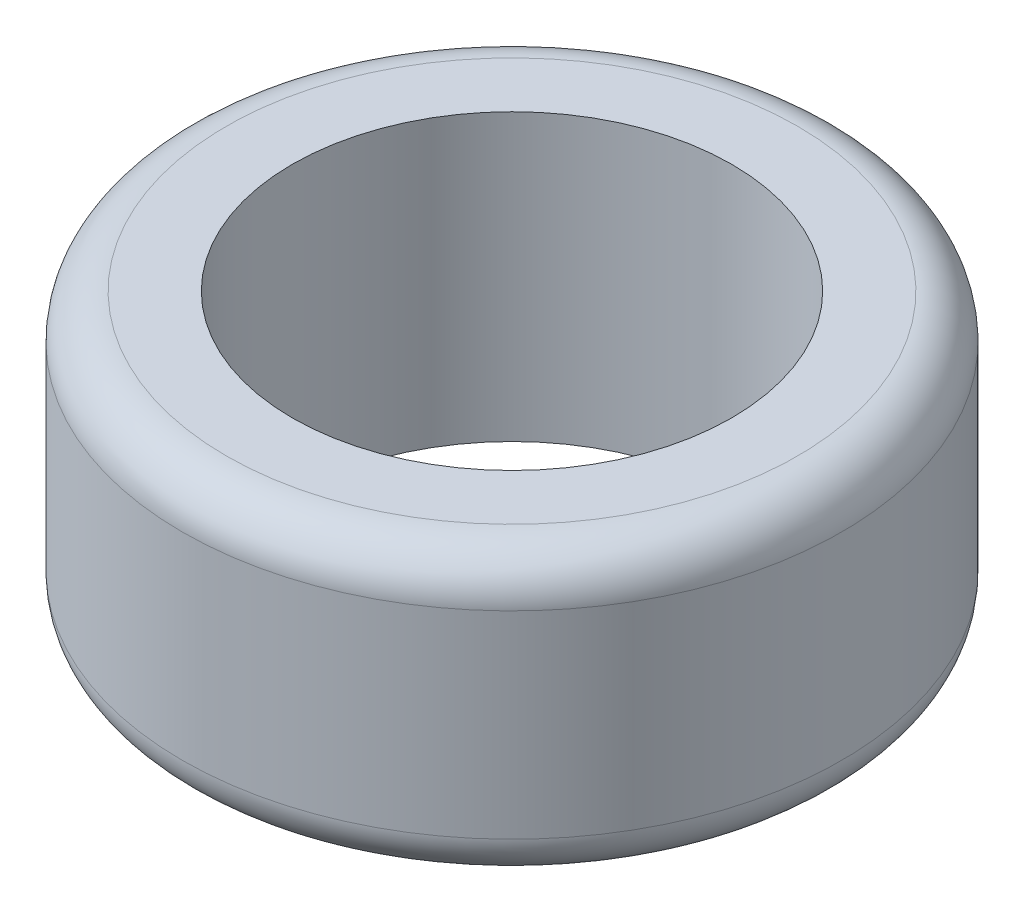
ISO-10303-21;
HEADER;
FILE_DESCRIPTION(('STEP AP214'),'2;1');
FILE_NAME('part.step','',(''),(''),'','','');
FILE_SCHEMA(('AUTOMOTIVE_DESIGN { 1 0 10303 214 1 1 1 1 }'));
ENDSEC;
DATA;
#1=APPLICATION_CONTEXT('core data for automotive mechanical design processes');
#2=APPLICATION_PROTOCOL_DEFINITION('international standard','automotive_design',2000,#1);
#3=PRODUCT_CONTEXT('',#1,'mechanical');
#4=PRODUCT('Part','Part','',(#3));
#5=PRODUCT_RELATED_PRODUCT_CATEGORY('part','',(#4));
#6=PRODUCT_DEFINITION_FORMATION('','',#4);
#7=PRODUCT_DEFINITION_CONTEXT('part definition',#1,'design');
#8=PRODUCT_DEFINITION('design','',#6,#7);
#9=PRODUCT_DEFINITION_SHAPE('','',#8);
#10=(LENGTH_UNIT() NAMED_UNIT(*) SI_UNIT(.MILLI.,.METRE.));
#11=(NAMED_UNIT(*) PLANE_ANGLE_UNIT() SI_UNIT($,.RADIAN.));
#12=(NAMED_UNIT(*) SI_UNIT($,.STERADIAN.) SOLID_ANGLE_UNIT());
#13=UNCERTAINTY_MEASURE_WITH_UNIT(LENGTH_MEASURE(1.E-05),#10,'distance_accuracy_value','');
#14=(GEOMETRIC_REPRESENTATION_CONTEXT(3) GLOBAL_UNCERTAINTY_ASSIGNED_CONTEXT((#13)) GLOBAL_UNIT_ASSIGNED_CONTEXT((#10,
#11,#12)) REPRESENTATION_CONTEXT('',''));
#15=CARTESIAN_POINT('',(0.,0.,0.));
#16=DIRECTION('',(0.,0.,1.));
#17=DIRECTION('',(1.,0.,0.));
#18=AXIS2_PLACEMENT_3D('',#15,#16,#17);
#19=CARTESIAN_POINT('',(0.,13.,0.));
#20=DIRECTION('',(0.,1.,0.));
#21=DIRECTION('',(0.,0.,1.));
#22=AXIS2_PLACEMENT_3D('',#19,#20,#21);
#23=PLANE('',#22);
#24=CARTESIAN_POINT('',(0.,13.,0.));
#25=DIRECTION('',(0.,1.,0.));
#26=DIRECTION('',(0.,0.,1.));
#27=AXIS2_PLACEMENT_3D('',#24,#25,#26);
#28=CIRCLE('',#27,13.);
#29=CARTESIAN_POINT('',(0.,13.,13.));
#30=VERTEX_POINT('',#29);
#31=EDGE_CURVE('E10',#30,#30,#28,.T.);
#32=ORIENTED_EDGE('',*,*,#31,.T.);
#33=EDGE_LOOP('',(#32));
#34=FACE_BOUND('',#33,.T.);
#35=CARTESIAN_POINT('',(0.,13.,0.));
#36=DIRECTION('',(0.,1.,0.));
#37=DIRECTION('',(0.,0.,1.));
#38=AXIS2_PLACEMENT_3D('',#35,#36,#37);
#39=CIRCLE('',#38,10.);
#40=CARTESIAN_POINT('',(0.,13.,-10.));
#41=VERTEX_POINT('',#40);
#42=EDGE_CURVE('E54',#41,#41,#39,.T.);
#43=ORIENTED_EDGE('',*,*,#42,.F.);
#44=EDGE_LOOP('',(#43));
#45=FACE_BOUND('',#44,.T.);
#46=ADVANCED_FACE('F34',(#34,#45),#23,.T.);
#47=CARTESIAN_POINT('',(0.,0.,0.));
#48=DIRECTION('',(0.,1.,0.));
#49=DIRECTION('',(0.,0.,1.));
#50=AXIS2_PLACEMENT_3D('',#47,#48,#49);
#51=PLANE('',#50);
#52=CARTESIAN_POINT('',(0.,0.,0.));
#53=DIRECTION('',(0.,1.,0.));
#54=DIRECTION('',(0.,0.,1.));
#55=AXIS2_PLACEMENT_3D('',#52,#53,#54);
#56=CIRCLE('',#55,13.);
#57=CARTESIAN_POINT('',(0.,0.,13.));
#58=VERTEX_POINT('',#57);
#59=EDGE_CURVE('E41',#58,#58,#56,.F.);
#60=ORIENTED_EDGE('',*,*,#59,.T.);
#61=EDGE_LOOP('',(#60));
#62=FACE_BOUND('',#61,.T.);
#63=CARTESIAN_POINT('',(0.,0.,0.));
#64=DIRECTION('',(0.,1.,0.));
#65=DIRECTION('',(0.,0.,1.));
#66=AXIS2_PLACEMENT_3D('',#63,#64,#65);
#67=CIRCLE('',#66,10.);
#68=CARTESIAN_POINT('',(0.,0.,-10.));
#69=VERTEX_POINT('',#68);
#70=EDGE_CURVE('E55',#69,#69,#67,.T.);
#71=ORIENTED_EDGE('',*,*,#70,.T.);
#72=EDGE_LOOP('',(#71));
#73=FACE_BOUND('',#72,.T.);
#74=ADVANCED_FACE('F65',(#62,#73),#51,.F.);
#75=CARTESIAN_POINT('',(0.,13.,0.));
#76=DIRECTION('',(0.,-1.,0.));
#77=DIRECTION('',(0.,0.,-1.));
#78=AXIS2_PLACEMENT_3D('',#75,#76,#77);
#79=CYLINDRICAL_SURFACE('',#78,15.);
#80=CARTESIAN_POINT('',(0.,2.,0.));
#81=DIRECTION('',(0.,1.,0.));
#82=DIRECTION('',(0.,0.,1.));
#83=AXIS2_PLACEMENT_3D('',#80,#81,#82);
#84=CIRCLE('',#83,15.);
#85=CARTESIAN_POINT('',(0.,2.,-15.));
#86=VERTEX_POINT('',#85);
#87=EDGE_CURVE('E45',#86,#86,#84,.T.);
#88=CARTESIAN_POINT('',(0.,11.,0.));
#89=DIRECTION('',(0.,1.,0.));
#90=DIRECTION('',(0.,0.,1.));
#91=AXIS2_PLACEMENT_3D('',#88,#89,#90);
#92=CIRCLE('',#91,15.);
#93=CARTESIAN_POINT('',(0.,11.,-15.));
#94=VERTEX_POINT('',#93);
#95=EDGE_CURVE('E49',#94,#94,#92,.F.);
#96=CARTESIAN_POINT('',(0.,2.,-15.));
#97=CARTESIAN_POINT('',(0.,2.09375,-15.));
#98=CARTESIAN_POINT('',(0.,2.1875,-15.));
#99=CARTESIAN_POINT('',(0.,2.375,-15.));
#100=CARTESIAN_POINT('',(0.,2.46875,-15.));
#101=CARTESIAN_POINT('',(0.,2.65625,-15.));
#102=CARTESIAN_POINT('',(0.,2.75,-15.));
#103=CARTESIAN_POINT('',(0.,2.9375,-15.));
#104=CARTESIAN_POINT('',(0.,3.03125,-15.));
#105=CARTESIAN_POINT('',(0.,3.21875,-15.));
#106=CARTESIAN_POINT('',(0.,3.3125,-15.));
#107=CARTESIAN_POINT('',(0.,3.5,-15.));
#108=CARTESIAN_POINT('',(0.,3.59375,-15.));
#109=CARTESIAN_POINT('',(0.,3.78125,-15.));
#110=CARTESIAN_POINT('',(0.,3.875,-15.));
#111=CARTESIAN_POINT('',(0.,4.0625,-15.));
#112=CARTESIAN_POINT('',(0.,4.15625,-15.));
#113=CARTESIAN_POINT('',(0.,4.34375,-15.));
#114=CARTESIAN_POINT('',(0.,4.4375,-15.));
#115=CARTESIAN_POINT('',(0.,4.625,-15.));
#116=CARTESIAN_POINT('',(0.,4.71875,-15.));
#117=CARTESIAN_POINT('',(0.,4.90625,-15.));
#118=CARTESIAN_POINT('',(0.,5.,-15.));
#119=CARTESIAN_POINT('',(0.,5.1875,-15.));
#120=CARTESIAN_POINT('',(0.,5.28125,-15.));
#121=CARTESIAN_POINT('',(0.,5.46875,-15.));
#122=CARTESIAN_POINT('',(0.,5.5625,-15.));
#123=CARTESIAN_POINT('',(0.,5.75,-15.));
#124=CARTESIAN_POINT('',(0.,5.84375,-15.));
#125=CARTESIAN_POINT('',(0.,6.03125,-15.));
#126=CARTESIAN_POINT('',(0.,6.125,-15.));
#127=CARTESIAN_POINT('',(0.,6.3125,-15.));
#128=CARTESIAN_POINT('',(0.,6.40625,-15.));
#129=CARTESIAN_POINT('',(0.,6.59375,-15.));
#130=CARTESIAN_POINT('',(0.,6.6875,-15.));
#131=CARTESIAN_POINT('',(0.,6.875,-15.));
#132=CARTESIAN_POINT('',(0.,6.96875,-15.));
#133=CARTESIAN_POINT('',(0.,7.15625,-15.));
#134=CARTESIAN_POINT('',(0.,7.25,-15.));
#135=CARTESIAN_POINT('',(0.,7.4375,-15.));
#136=CARTESIAN_POINT('',(0.,7.53125,-15.));
#137=CARTESIAN_POINT('',(0.,7.71875,-15.));
#138=CARTESIAN_POINT('',(0.,7.8125,-15.));
#139=CARTESIAN_POINT('',(0.,8.,-15.));
#140=CARTESIAN_POINT('',(0.,8.09375,-15.));
#141=CARTESIAN_POINT('',(0.,8.28125,-15.));
#142=CARTESIAN_POINT('',(0.,8.375,-15.));
#143=CARTESIAN_POINT('',(0.,8.5625,-15.));
#144=CARTESIAN_POINT('',(0.,8.65625,-15.));
#145=CARTESIAN_POINT('',(0.,8.84375,-15.));
#146=CARTESIAN_POINT('',(0.,8.9375,-15.));
#147=CARTESIAN_POINT('',(0.,9.125,-15.));
#148=CARTESIAN_POINT('',(0.,9.21875,-15.));
#149=CARTESIAN_POINT('',(0.,9.40625,-15.));
#150=CARTESIAN_POINT('',(0.,9.5,-15.));
#151=CARTESIAN_POINT('',(0.,9.6875,-15.));
#152=CARTESIAN_POINT('',(0.,9.78125,-15.));
#153=CARTESIAN_POINT('',(0.,9.96875,-15.));
#154=CARTESIAN_POINT('',(0.,10.0625,-15.));
#155=CARTESIAN_POINT('',(0.,10.25,-15.));
#156=CARTESIAN_POINT('',(0.,10.34375,-15.));
#157=CARTESIAN_POINT('',(0.,10.53125,-15.));
#158=CARTESIAN_POINT('',(0.,10.625,-15.));
#159=CARTESIAN_POINT('',(0.,10.8125,-15.));
#160=CARTESIAN_POINT('',(0.,10.90625,-15.));
#161=CARTESIAN_POINT('',(0.,11.,-15.));
#162=B_SPLINE_CURVE_WITH_KNOTS('',3,(#96,#97,#98,#99,#100,#101,#102,#103,#104,#105,#106,#107,
#108,#109,#110,#111,#112,#113,#114,#115,#116,#117,#118,#119,#120,#121,#122,#123,#124,#125,#126,
#127,#128,#129,#130,#131,#132,#133,#134,#135,#136,#137,#138,#139,#140,#141,#142,#143,#144,#145,
#146,#147,#148,#149,#150,#151,#152,#153,#154,#155,#156,#157,#158,#159,#160,#161),.UNSPECIFIED.,
.F.,.F.,(4,2,2,2,2,2,2,2,2,2,2,2,2,2,2,2,2,2,2,2,2,2,2,2,2,2,2,2,2,2,2,2,4),(0.,0.28125,0.5625,
0.843750000000001,1.125,1.40625,1.6875,1.96875,2.25,2.53125,2.8125,3.09375,3.375,3.65625,3.9375,
4.21875,4.5,4.78125,5.0625,5.34375,5.625,5.90625,6.1875,6.46875,6.75,7.03125,7.3125,7.59375,
7.875,8.15625,8.4375,8.71875,9.),.UNSPECIFIED.);
#163=EDGE_CURVE('BSEAM70',#86,#94,#162,.T.);
#164=ORIENTED_EDGE('',*,*,#87,.T.);
#165=ORIENTED_EDGE('',*,*,#95,.T.);
#166=ORIENTED_EDGE('',*,*,#163,.T.);
#167=ORIENTED_EDGE('',*,*,#163,.F.);
#168=EDGE_LOOP('',(#164,#166,#165,#167));
#169=FACE_BOUND('',#168,.T.);
#170=ADVANCED_FACE('F70',(#169),#79,.T.);
#171=CARTESIAN_POINT('',(0.,13.,0.));
#172=DIRECTION('',(0.,-1.,0.));
#173=DIRECTION('',(0.,0.,-1.));
#174=AXIS2_PLACEMENT_3D('',#171,#172,#173);
#175=CYLINDRICAL_SURFACE('',#174,10.);
#176=CARTESIAN_POINT('',(0.,13.,-10.));
#177=CARTESIAN_POINT('',(0.,12.8645833333333,-10.));
#178=CARTESIAN_POINT('',(0.,12.7291666666667,-10.));
#179=CARTESIAN_POINT('',(0.,12.4583333333333,-10.));
#180=CARTESIAN_POINT('',(0.,12.3229166666667,-10.));
#181=CARTESIAN_POINT('',(0.,12.0520833333333,-10.));
#182=CARTESIAN_POINT('',(0.,11.9166666666667,-10.));
#183=CARTESIAN_POINT('',(0.,11.6458333333333,-10.));
#184=CARTESIAN_POINT('',(0.,11.5104166666667,-10.));
#185=CARTESIAN_POINT('',(0.,11.2395833333333,-10.));
#186=CARTESIAN_POINT('',(0.,11.1041666666667,-10.));
#187=CARTESIAN_POINT('',(0.,10.8333333333333,-10.));
#188=CARTESIAN_POINT('',(0.,10.6979166666667,-10.));
#189=CARTESIAN_POINT('',(0.,10.4270833333333,-10.));
#190=CARTESIAN_POINT('',(0.,10.2916666666667,-10.));
#191=CARTESIAN_POINT('',(0.,10.0208333333333,-10.));
#192=CARTESIAN_POINT('',(0.,9.88541666666667,-10.));
#193=CARTESIAN_POINT('',(0.,9.61458333333333,-10.));
#194=CARTESIAN_POINT('',(0.,9.47916666666667,-10.));
#195=CARTESIAN_POINT('',(0.,9.20833333333333,-10.));
#196=CARTESIAN_POINT('',(0.,9.07291666666666,-10.));
#197=CARTESIAN_POINT('',(0.,8.80208333333333,-10.));
#198=CARTESIAN_POINT('',(0.,8.66666666666667,-10.));
#199=CARTESIAN_POINT('',(0.,8.39583333333333,-10.));
#200=CARTESIAN_POINT('',(0.,8.26041666666667,-10.));
#201=CARTESIAN_POINT('',(0.,7.98958333333333,-10.));
#202=CARTESIAN_POINT('',(0.,7.85416666666667,-10.));
#203=CARTESIAN_POINT('',(0.,7.58333333333333,-10.));
#204=CARTESIAN_POINT('',(0.,7.44791666666667,-10.));
#205=CARTESIAN_POINT('',(0.,7.17708333333333,-10.));
#206=CARTESIAN_POINT('',(0.,7.04166666666667,-10.));
#207=CARTESIAN_POINT('',(0.,6.77083333333333,-10.));
#208=CARTESIAN_POINT('',(0.,6.63541666666667,-10.));
#209=CARTESIAN_POINT('',(0.,6.36458333333333,-10.));
#210=CARTESIAN_POINT('',(0.,6.22916666666667,-10.));
#211=CARTESIAN_POINT('',(0.,5.95833333333333,-10.));
#212=CARTESIAN_POINT('',(0.,5.82291666666667,-10.));
#213=CARTESIAN_POINT('',(0.,5.55208333333333,-10.));
#214=CARTESIAN_POINT('',(0.,5.41666666666667,-10.));
#215=CARTESIAN_POINT('',(0.,5.14583333333333,-10.));
#216=CARTESIAN_POINT('',(0.,5.01041666666667,-10.));
#217=CARTESIAN_POINT('',(0.,4.73958333333333,-10.));
#218=CARTESIAN_POINT('',(0.,4.60416666666667,-10.));
#219=CARTESIAN_POINT('',(0.,4.33333333333333,-10.));
#220=CARTESIAN_POINT('',(0.,4.19791666666667,-10.));
#221=CARTESIAN_POINT('',(0.,3.92708333333333,-10.));
#222=CARTESIAN_POINT('',(0.,3.79166666666667,-10.));
#223=CARTESIAN_POINT('',(0.,3.52083333333333,-10.));
#224=CARTESIAN_POINT('',(0.,3.38541666666667,-10.));
#225=CARTESIAN_POINT('',(0.,3.11458333333333,-10.));
#226=CARTESIAN_POINT('',(0.,2.97916666666667,-10.));
#227=CARTESIAN_POINT('',(0.,2.70833333333333,-10.));
#228=CARTESIAN_POINT('',(0.,2.57291666666667,-10.));
#229=CARTESIAN_POINT('',(0.,2.30208333333333,-10.));
#230=CARTESIAN_POINT('',(0.,2.16666666666667,-10.));
#231=CARTESIAN_POINT('',(0.,1.89583333333333,-10.));
#232=CARTESIAN_POINT('',(0.,1.76041666666667,-10.));
#233=CARTESIAN_POINT('',(0.,1.48958333333333,-10.));
#234=CARTESIAN_POINT('',(0.,1.35416666666667,-10.));
#235=CARTESIAN_POINT('',(0.,1.08333333333333,-10.));
#236=CARTESIAN_POINT('',(0.,0.947916666666667,-10.));
#237=CARTESIAN_POINT('',(0.,0.677083333333334,-10.));
#238=CARTESIAN_POINT('',(0.,0.541666666666667,-10.));
#239=CARTESIAN_POINT('',(0.,0.270833333333334,-10.));
#240=CARTESIAN_POINT('',(0.,0.135416666666667,-10.));
#241=CARTESIAN_POINT('',(0.,0.,-10.));
#242=B_SPLINE_CURVE_WITH_KNOTS('',3,(#176,#177,#178,#179,#180,#181,#182,#183,#184,#185,#186,
#187,#188,#189,#190,#191,#192,#193,#194,#195,#196,#197,#198,#199,#200,#201,#202,#203,#204,#205,
#206,#207,#208,#209,#210,#211,#212,#213,#214,#215,#216,#217,#218,#219,#220,#221,#222,#223,#224,
#225,#226,#227,#228,#229,#230,#231,#232,#233,#234,#235,#236,#237,#238,#239,#240,#241),
.UNSPECIFIED.,.F.,.F.,(4,2,2,2,2,2,2,2,2,2,2,2,2,2,2,2,2,2,2,2,2,2,2,2,2,2,2,2,2,2,2,2,4),(0.,
0.40625,0.812500000000001,1.21875,1.625,2.03125,2.4375,2.84375,3.25,3.65625,4.0625,4.46875,
4.875,5.28125,5.6875,6.09375,6.5,6.90625,7.3125,7.71875,8.125,8.53125,8.9375,9.34375,9.75,
10.15625,10.5625,10.96875,11.375,11.78125,12.1875,12.59375,13.),.UNSPECIFIED.);
#243=EDGE_CURVE('BSEAM61',#41,#69,#242,.T.);
#244=ORIENTED_EDGE('',*,*,#42,.T.);
#245=ORIENTED_EDGE('',*,*,#70,.F.);
#246=ORIENTED_EDGE('',*,*,#243,.T.);
#247=ORIENTED_EDGE('',*,*,#243,.F.);
#248=EDGE_LOOP('',(#244,#246,#245,#247));
#249=FACE_BOUND('',#248,.T.);
#250=ADVANCED_FACE('F61',(#249),#175,.F.);
#251=CARTESIAN_POINT('',(0.,2.,0.));
#252=DIRECTION('',(0.,1.,0.));
#253=DIRECTION('',(0.,0.,1.));
#254=AXIS2_PLACEMENT_3D('',#251,#252,#253);
#255=TOROIDAL_SURFACE('',#254,13.,2.);
#256=ORIENTED_EDGE('',*,*,#59,.F.);
#257=EDGE_LOOP('',(#256));
#258=FACE_BOUND('',#257,.T.);
#259=ORIENTED_EDGE('',*,*,#87,.F.);
#260=EDGE_LOOP('',(#259));
#261=FACE_BOUND('',#260,.T.);
#262=ADVANCED_FACE('F76',(#258,#261),#255,.T.);
#263=CARTESIAN_POINT('',(0.,11.,0.));
#264=DIRECTION('',(0.,1.,0.));
#265=DIRECTION('',(0.,0.,1.));
#266=AXIS2_PLACEMENT_3D('',#263,#264,#265);
#267=TOROIDAL_SURFACE('',#266,13.,2.);
#268=ORIENTED_EDGE('',*,*,#95,.F.);
#269=EDGE_LOOP('',(#268));
#270=FACE_BOUND('',#269,.T.);
#271=ORIENTED_EDGE('',*,*,#31,.F.);
#272=EDGE_LOOP('',(#271));
#273=FACE_BOUND('',#272,.T.);
#274=ADVANCED_FACE('F36',(#270,#273),#267,.T.);
#275=CLOSED_SHELL('',(#46,#74,#170,#250,#262,#274));
#276=MANIFOLD_SOLID_BREP('B2',#275);
#277=ADVANCED_BREP_SHAPE_REPRESENTATION('',(#18,#276),#14);
#278=SHAPE_DEFINITION_REPRESENTATION(#9,#277);
ENDSEC;
END-ISO-10303-21;
